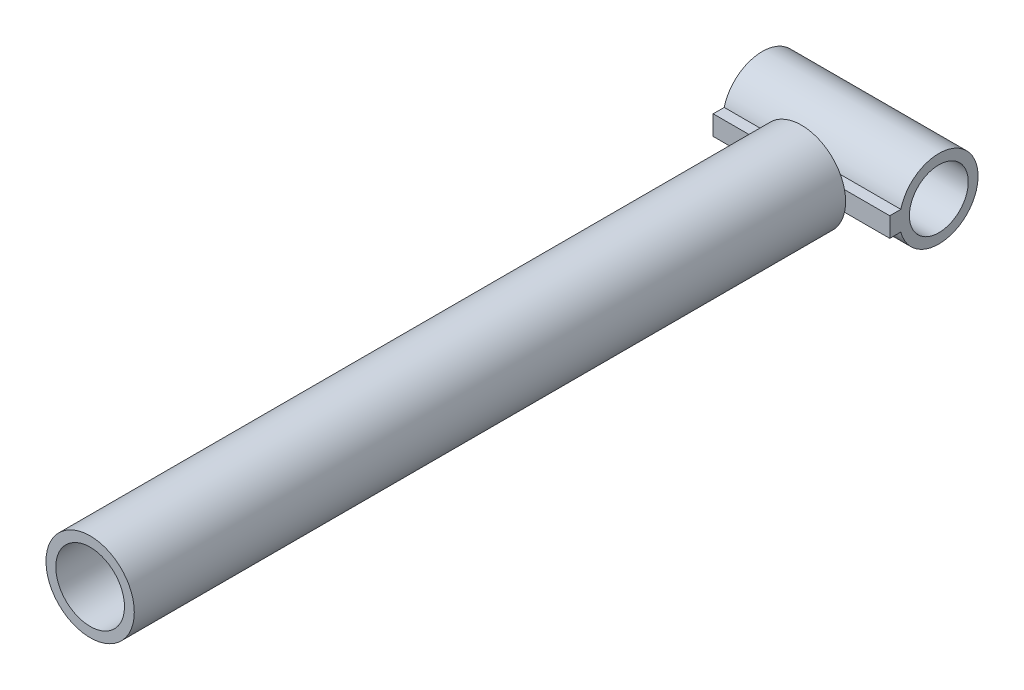
ISO-10303-21;
HEADER;
FILE_DESCRIPTION(('STEP AP214'),'2;1');
FILE_NAME('part.step','',(''),(''),'','','');
FILE_SCHEMA(('AUTOMOTIVE_DESIGN { 1 0 10303 214 1 1 1 1 }'));
ENDSEC;
DATA;
#1=APPLICATION_CONTEXT('core data for automotive mechanical design processes');
#2=APPLICATION_PROTOCOL_DEFINITION('international standard','automotive_design',2000,#1);
#3=PRODUCT_CONTEXT('',#1,'mechanical');
#4=PRODUCT('Part','Part','',(#3));
#5=PRODUCT_RELATED_PRODUCT_CATEGORY('part','',(#4));
#6=PRODUCT_DEFINITION_FORMATION('','',#4);
#7=PRODUCT_DEFINITION_CONTEXT('part definition',#1,'design');
#8=PRODUCT_DEFINITION('design','',#6,#7);
#9=PRODUCT_DEFINITION_SHAPE('','',#8);
#10=(LENGTH_UNIT() NAMED_UNIT(*) SI_UNIT(.MILLI.,.METRE.));
#11=(NAMED_UNIT(*) PLANE_ANGLE_UNIT() SI_UNIT($,.RADIAN.));
#12=(NAMED_UNIT(*) SI_UNIT($,.STERADIAN.) SOLID_ANGLE_UNIT());
#13=UNCERTAINTY_MEASURE_WITH_UNIT(LENGTH_MEASURE(1.E-05),#10,'distance_accuracy_value','');
#14=(GEOMETRIC_REPRESENTATION_CONTEXT(3) GLOBAL_UNCERTAINTY_ASSIGNED_CONTEXT((#13)) GLOBAL_UNIT_ASSIGNED_CONTEXT((#10,
#11,#12)) REPRESENTATION_CONTEXT('',''));
#15=CARTESIAN_POINT('',(0.,0.,0.));
#16=DIRECTION('',(0.,0.,1.));
#17=DIRECTION('',(1.,0.,0.));
#18=AXIS2_PLACEMENT_3D('',#15,#16,#17);
#19=CARTESIAN_POINT('',(0.,0.,0.));
#20=DIRECTION('',(0.,0.,1.));
#21=DIRECTION('',(1.,0.,0.));
#22=AXIS2_PLACEMENT_3D('',#19,#20,#21);
#23=PLANE('',#22);
#24=DIRECTION('',(-1.,0.,0.));
#25=VECTOR('',#24,1.);
#26=CARTESIAN_POINT('',(90.,-10.,0.));
#27=LINE('',#26,#25);
#28=CARTESIAN_POINT('',(43.8748219369606,-10.,0.));
#29=VERTEX_POINT('',#28);
#30=CARTESIAN_POINT('',(-43.8748219369605,-10.,0.));
#31=VERTEX_POINT('',#30);
#32=EDGE_CURVE('E11',#29,#31,#27,.T.);
#33=ORIENTED_EDGE('',*,*,#32,.F.);
#34=CARTESIAN_POINT('',(0.,0.,0.));
#35=DIRECTION('',(0.,0.,1.));
#36=DIRECTION('',(1.,0.,0.));
#37=AXIS2_PLACEMENT_3D('',#34,#35,#36);
#38=CIRCLE('',#37,45.);
#39=EDGE_CURVE('E132',#31,#29,#38,.T.);
#40=ORIENTED_EDGE('',*,*,#39,.F.);
#41=EDGE_LOOP('',(#33,#40));
#42=FACE_BOUND('',#41,.T.);
#43=ADVANCED_FACE('F34',(#42),#23,.F.);
#44=CARTESIAN_POINT('',(0.,0.,725.));
#45=DIRECTION('',(0.,0.,-1.));
#46=DIRECTION('',(-1.,0.,0.));
#47=AXIS2_PLACEMENT_3D('',#44,#45,#46);
#48=CYLINDRICAL_SURFACE('',#47,45.);
#49=CARTESIAN_POINT('',(0.,0.,725.));
#50=DIRECTION('',(0.,0.,1.));
#51=DIRECTION('',(1.,0.,0.));
#52=AXIS2_PLACEMENT_3D('',#49,#50,#51);
#53=CIRCLE('',#52,45.);
#54=CARTESIAN_POINT('',(45.,0.,725.));
#55=VERTEX_POINT('',#54);
#56=EDGE_CURVE('E121',#55,#55,#53,.T.);
#57=ORIENTED_EDGE('',*,*,#56,.F.);
#58=EDGE_LOOP('',(#57));
#59=FACE_BOUND('',#58,.T.);
#60=CARTESIAN_POINT('',(43.8748219369606,9.99999999999999,0.));
#61=VERTEX_POINT('',#60);
#62=CARTESIAN_POINT('',(-43.8748219369606,9.99999999999998,0.));
#63=VERTEX_POINT('',#62);
#64=EDGE_CURVE('E38',#61,#63,#38,.T.);
#65=ORIENTED_EDGE('',*,*,#64,.T.);
#66=EDGE_CURVE('E128',#63,#31,#38,.T.);
#67=ORIENTED_EDGE('',*,*,#66,.T.);
#68=ORIENTED_EDGE('',*,*,#39,.T.);
#69=EDGE_CURVE('E112',#29,#61,#38,.T.);
#70=ORIENTED_EDGE('',*,*,#69,.T.);
#71=EDGE_LOOP('',(#65,#67,#68,#70));
#72=FACE_BOUND('',#71,.T.);
#73=ADVANCED_FACE('F36',(#59,#72),#48,.T.);
#74=CARTESIAN_POINT('',(0.,0.,725.));
#75=DIRECTION('',(0.,0.,1.));
#76=DIRECTION('',(1.,0.,0.));
#77=AXIS2_PLACEMENT_3D('',#74,#75,#76);
#78=PLANE('',#77);
#79=CARTESIAN_POINT('',(0.,0.,725.));
#80=DIRECTION('',(0.,0.,1.));
#81=DIRECTION('',(1.,0.,0.));
#82=AXIS2_PLACEMENT_3D('',#79,#80,#81);
#83=CIRCLE('',#82,35.);
#84=CARTESIAN_POINT('',(35.,0.,725.));
#85=VERTEX_POINT('',#84);
#86=EDGE_CURVE('E113',#85,#85,#83,.T.);
#87=ORIENTED_EDGE('',*,*,#86,.F.);
#88=EDGE_LOOP('',(#87));
#89=FACE_BOUND('',#88,.T.);
#90=ORIENTED_EDGE('',*,*,#56,.T.);
#91=EDGE_LOOP('',(#90));
#92=FACE_BOUND('',#91,.T.);
#93=ADVANCED_FACE('F183',(#89,#92),#78,.T.);
#94=ORIENTED_EDGE('',*,*,#64,.F.);
#95=DIRECTION('',(-1.,0.,0.));
#96=VECTOR('',#95,1.);
#97=CARTESIAN_POINT('',(90.,9.99999999999999,0.));
#98=LINE('',#97,#96);
#99=EDGE_CURVE('E43',#61,#63,#98,.T.);
#100=ORIENTED_EDGE('',*,*,#99,.T.);
#101=EDGE_LOOP('',(#94,#100));
#102=FACE_BOUND('',#101,.T.);
#103=ADVANCED_FACE('F179',(#102),#23,.F.);
#104=CARTESIAN_POINT('',(0.,0.,125.));
#105=DIRECTION('',(0.,0.,1.));
#106=DIRECTION('',(1.,0.,0.));
#107=AXIS2_PLACEMENT_3D('',#104,#105,#106);
#108=CYLINDRICAL_SURFACE('',#107,35.);
#109=CARTESIAN_POINT('',(0.,0.,125.));
#110=DIRECTION('',(0.,0.,1.));
#111=DIRECTION('',(1.,0.,0.));
#112=AXIS2_PLACEMENT_3D('',#109,#110,#111);
#113=CIRCLE('',#112,35.);
#114=CARTESIAN_POINT('',(35.,0.,125.));
#115=VERTEX_POINT('',#114);
#116=EDGE_CURVE('E115',#115,#115,#113,.T.);
#117=ORIENTED_EDGE('',*,*,#116,.F.);
#118=EDGE_LOOP('',(#117));
#119=FACE_BOUND('',#118,.T.);
#120=ORIENTED_EDGE('',*,*,#86,.T.);
#121=EDGE_LOOP('',(#120));
#122=FACE_BOUND('',#121,.T.);
#123=ADVANCED_FACE('F187',(#119,#122),#108,.F.);
#124=CARTESIAN_POINT('',(0.,0.,125.));
#125=DIRECTION('',(0.,0.,1.));
#126=DIRECTION('',(1.,0.,0.));
#127=AXIS2_PLACEMENT_3D('',#124,#125,#126);
#128=PLANE('',#127);
#129=ORIENTED_EDGE('',*,*,#116,.T.);
#130=EDGE_LOOP('',(#129));
#131=FACE_BOUND('',#130,.T.);
#132=ADVANCED_FACE('F193',(#131),#128,.T.);
#133=CARTESIAN_POINT('',(90.,9.99999999999999,0.));
#134=DIRECTION('',(0.,0.,-1.));
#135=DIRECTION('',(-1.,0.,0.));
#136=AXIS2_PLACEMENT_3D('',#133,#134,#135);
#137=PLANE('',#136);
#138=ORIENTED_EDGE('',*,*,#66,.F.);
#139=CARTESIAN_POINT('',(-90.,9.99999999999999,0.));
#140=VERTEX_POINT('',#139);
#141=EDGE_CURVE('E53',#63,#140,#98,.T.);
#142=ORIENTED_EDGE('',*,*,#141,.T.);
#143=DIRECTION('',(0.,-1.,0.));
#144=VECTOR('',#143,1.);
#145=CARTESIAN_POINT('',(-90.,9.99999999999999,0.));
#146=LINE('',#145,#144);
#147=CARTESIAN_POINT('',(-90.,-10.,0.));
#148=VERTEX_POINT('',#147);
#149=EDGE_CURVE('E146',#140,#148,#146,.T.);
#150=ORIENTED_EDGE('',*,*,#149,.T.);
#151=EDGE_CURVE('E46',#31,#148,#27,.T.);
#152=ORIENTED_EDGE('',*,*,#151,.F.);
#153=EDGE_LOOP('',(#138,#142,#150,#152));
#154=FACE_BOUND('',#153,.T.);
#155=ADVANCED_FACE('F149',(#154),#137,.F.);
#156=CARTESIAN_POINT('',(90.,0.,-50.));
#157=DIRECTION('',(1.,0.,0.));
#158=DIRECTION('',(0.,0.,-1.));
#159=AXIS2_PLACEMENT_3D('',#156,#157,#158);
#160=PLANE('',#159);
#161=DIRECTION('',(0.,-1.,0.));
#162=VECTOR('',#161,1.);
#163=CARTESIAN_POINT('',(90.,9.99999999999999,0.));
#164=LINE('',#163,#162);
#165=CARTESIAN_POINT('',(90.,9.99999999999999,0.));
#166=VERTEX_POINT('',#165);
#167=CARTESIAN_POINT('',(90.,-10.,0.));
#168=VERTEX_POINT('',#167);
#169=EDGE_CURVE('E100',#166,#168,#164,.T.);
#170=ORIENTED_EDGE('',*,*,#169,.T.);
#171=DIRECTION('',(0.,0.,-1.));
#172=VECTOR('',#171,1.);
#173=CARTESIAN_POINT('',(90.,-10.,0.));
#174=LINE('',#173,#172);
#175=CARTESIAN_POINT('',(90.,-10.,-11.2701665379259));
#176=VERTEX_POINT('',#175);
#177=EDGE_CURVE('E90',#168,#176,#174,.T.);
#178=ORIENTED_EDGE('',*,*,#177,.T.);
#179=CARTESIAN_POINT('',(90.,0.,-50.));
#180=DIRECTION('',(1.,0.,0.));
#181=DIRECTION('',(0.,0.,-1.));
#182=AXIS2_PLACEMENT_3D('',#179,#180,#181);
#183=CIRCLE('',#182,40.);
#184=CARTESIAN_POINT('',(90.,9.99999999999999,-11.2701665379258));
#185=VERTEX_POINT('',#184);
#186=EDGE_CURVE('E99',#176,#185,#183,.T.);
#187=ORIENTED_EDGE('',*,*,#186,.T.);
#188=DIRECTION('',(0.,0.,1.));
#189=VECTOR('',#188,1.);
#190=CARTESIAN_POINT('',(90.,9.99999999999999,0.));
#191=LINE('',#190,#189);
#192=EDGE_CURVE('E106',#185,#166,#191,.T.);
#193=ORIENTED_EDGE('',*,*,#192,.T.);
#194=EDGE_LOOP('',(#170,#178,#187,#193));
#195=FACE_BOUND('',#194,.T.);
#196=CARTESIAN_POINT('',(90.,0.,-50.));
#197=DIRECTION('',(1.,0.,0.));
#198=DIRECTION('',(0.,0.,-1.));
#199=AXIS2_PLACEMENT_3D('',#196,#197,#198);
#200=CIRCLE('',#199,30.);
#201=CARTESIAN_POINT('',(90.,0.,-20.));
#202=VERTEX_POINT('',#201);
#203=EDGE_CURVE('E150',#202,#202,#200,.T.);
#204=ORIENTED_EDGE('',*,*,#203,.F.);
#205=EDGE_LOOP('',(#204));
#206=FACE_BOUND('',#205,.T.);
#207=ADVANCED_FACE('F103',(#195,#206),#160,.T.);
#208=CARTESIAN_POINT('',(-90.,0.,-50.));
#209=DIRECTION('',(1.,0.,0.));
#210=DIRECTION('',(0.,0.,-1.));
#211=AXIS2_PLACEMENT_3D('',#208,#209,#210);
#212=PLANE('',#211);
#213=ORIENTED_EDGE('',*,*,#149,.F.);
#214=DIRECTION('',(0.,0.,1.));
#215=VECTOR('',#214,1.);
#216=CARTESIAN_POINT('',(-90.,9.99999999999999,0.));
#217=LINE('',#216,#215);
#218=CARTESIAN_POINT('',(-90.,9.99999999999999,-11.2701665379258));
#219=VERTEX_POINT('',#218);
#220=EDGE_CURVE('E108',#219,#140,#217,.T.);
#221=ORIENTED_EDGE('',*,*,#220,.F.);
#222=CARTESIAN_POINT('',(-90.,0.,-50.));
#223=DIRECTION('',(1.,0.,0.));
#224=DIRECTION('',(0.,0.,-1.));
#225=AXIS2_PLACEMENT_3D('',#222,#223,#224);
#226=CIRCLE('',#225,40.);
#227=CARTESIAN_POINT('',(-90.,-10.,-11.2701665379259));
#228=VERTEX_POINT('',#227);
#229=EDGE_CURVE('E147',#228,#219,#226,.T.);
#230=ORIENTED_EDGE('',*,*,#229,.F.);
#231=DIRECTION('',(0.,0.,-1.));
#232=VECTOR('',#231,1.);
#233=CARTESIAN_POINT('',(-90.,-10.,0.));
#234=LINE('',#233,#232);
#235=EDGE_CURVE('E137',#148,#228,#234,.T.);
#236=ORIENTED_EDGE('',*,*,#235,.F.);
#237=EDGE_LOOP('',(#213,#221,#230,#236));
#238=FACE_BOUND('',#237,.T.);
#239=CARTESIAN_POINT('',(-90.,0.,-50.));
#240=DIRECTION('',(1.,0.,0.));
#241=DIRECTION('',(0.,0.,-1.));
#242=AXIS2_PLACEMENT_3D('',#239,#240,#241);
#243=CIRCLE('',#242,30.);
#244=CARTESIAN_POINT('',(-90.,0.,-20.));
#245=VERTEX_POINT('',#244);
#246=EDGE_CURVE('E153',#245,#245,#243,.T.);
#247=ORIENTED_EDGE('',*,*,#246,.T.);
#248=EDGE_LOOP('',(#247));
#249=FACE_BOUND('',#248,.T.);
#250=ADVANCED_FACE('F143',(#238,#249),#212,.F.);
#251=ORIENTED_EDGE('',*,*,#69,.F.);
#252=EDGE_CURVE('E45',#168,#29,#27,.T.);
#253=ORIENTED_EDGE('',*,*,#252,.F.);
#254=ORIENTED_EDGE('',*,*,#169,.F.);
#255=EDGE_CURVE('E126',#166,#61,#98,.T.);
#256=ORIENTED_EDGE('',*,*,#255,.T.);
#257=EDGE_LOOP('',(#251,#253,#254,#256));
#258=FACE_BOUND('',#257,.T.);
#259=ADVANCED_FACE('F110',(#258),#137,.F.);
#260=CARTESIAN_POINT('',(90.,-10.,0.));
#261=DIRECTION('',(0.,1.,0.));
#262=DIRECTION('',(0.,0.,1.));
#263=AXIS2_PLACEMENT_3D('',#260,#261,#262);
#264=PLANE('',#263);
#265=ORIENTED_EDGE('',*,*,#235,.T.);
#266=DIRECTION('',(-1.,0.,0.));
#267=VECTOR('',#266,1.);
#268=CARTESIAN_POINT('',(90.,-10.,-11.2701665379259));
#269=LINE('',#268,#267);
#270=EDGE_CURVE('E96',#176,#228,#269,.T.);
#271=ORIENTED_EDGE('',*,*,#270,.F.);
#272=ORIENTED_EDGE('',*,*,#177,.F.);
#273=ORIENTED_EDGE('',*,*,#252,.T.);
#274=ORIENTED_EDGE('',*,*,#32,.T.);
#275=ORIENTED_EDGE('',*,*,#151,.T.);
#276=EDGE_LOOP('',(#265,#271,#272,#273,#274,#275));
#277=FACE_BOUND('',#276,.T.);
#278=ADVANCED_FACE('F92',(#277),#264,.F.);
#279=CARTESIAN_POINT('',(90.,0.,-50.));
#280=DIRECTION('',(-1.,0.,0.));
#281=DIRECTION('',(0.,0.,1.));
#282=AXIS2_PLACEMENT_3D('',#279,#280,#281);
#283=CYLINDRICAL_SURFACE('',#282,40.);
#284=ORIENTED_EDGE('',*,*,#229,.T.);
#285=DIRECTION('',(-1.,0.,0.));
#286=VECTOR('',#285,1.);
#287=CARTESIAN_POINT('',(90.,9.99999999999999,-11.2701665379258));
#288=LINE('',#287,#286);
#289=EDGE_CURVE('E159',#185,#219,#288,.T.);
#290=ORIENTED_EDGE('',*,*,#289,.F.);
#291=ORIENTED_EDGE('',*,*,#186,.F.);
#292=ORIENTED_EDGE('',*,*,#270,.T.);
#293=EDGE_LOOP('',(#284,#290,#291,#292));
#294=FACE_BOUND('',#293,.T.);
#295=ADVANCED_FACE('F163',(#294),#283,.T.);
#296=CARTESIAN_POINT('',(90.,9.99999999999999,0.));
#297=DIRECTION('',(0.,-1.,0.));
#298=DIRECTION('',(0.,0.,-1.));
#299=AXIS2_PLACEMENT_3D('',#296,#297,#298);
#300=PLANE('',#299);
#301=ORIENTED_EDGE('',*,*,#220,.T.);
#302=ORIENTED_EDGE('',*,*,#141,.F.);
#303=ORIENTED_EDGE('',*,*,#99,.F.);
#304=ORIENTED_EDGE('',*,*,#255,.F.);
#305=ORIENTED_EDGE('',*,*,#192,.F.);
#306=ORIENTED_EDGE('',*,*,#289,.T.);
#307=EDGE_LOOP('',(#301,#302,#303,#304,#305,#306));
#308=FACE_BOUND('',#307,.T.);
#309=ADVANCED_FACE('F170',(#308),#300,.F.);
#310=CARTESIAN_POINT('',(90.,0.,-50.));
#311=DIRECTION('',(-1.,0.,0.));
#312=DIRECTION('',(0.,0.,1.));
#313=AXIS2_PLACEMENT_3D('',#310,#311,#312);
#314=CYLINDRICAL_SURFACE('',#313,30.);
#315=CARTESIAN_POINT('',(90.,0.,-20.));
#316=CARTESIAN_POINT('',(88.125,0.,-20.));
#317=CARTESIAN_POINT('',(86.25,0.,-20.));
#318=CARTESIAN_POINT('',(82.5,0.,-20.));
#319=CARTESIAN_POINT('',(80.625,0.,-20.));
#320=CARTESIAN_POINT('',(76.875,0.,-20.));
#321=CARTESIAN_POINT('',(75.,0.,-20.));
#322=CARTESIAN_POINT('',(71.25,0.,-20.));
#323=CARTESIAN_POINT('',(69.375,0.,-20.));
#324=CARTESIAN_POINT('',(65.625,0.,-20.));
#325=CARTESIAN_POINT('',(63.75,0.,-20.));
#326=CARTESIAN_POINT('',(60.,0.,-20.));
#327=CARTESIAN_POINT('',(58.125,0.,-20.));
#328=CARTESIAN_POINT('',(54.375,0.,-20.));
#329=CARTESIAN_POINT('',(52.5,0.,-20.));
#330=CARTESIAN_POINT('',(48.75,0.,-20.));
#331=CARTESIAN_POINT('',(46.875,0.,-20.));
#332=CARTESIAN_POINT('',(43.125,0.,-20.));
#333=CARTESIAN_POINT('',(41.25,0.,-20.));
#334=CARTESIAN_POINT('',(37.5,0.,-20.));
#335=CARTESIAN_POINT('',(35.625,0.,-20.));
#336=CARTESIAN_POINT('',(31.875,0.,-20.));
#337=CARTESIAN_POINT('',(30.,0.,-20.));
#338=CARTESIAN_POINT('',(26.25,0.,-20.));
#339=CARTESIAN_POINT('',(24.375,0.,-20.));
#340=CARTESIAN_POINT('',(20.625,0.,-20.));
#341=CARTESIAN_POINT('',(18.75,0.,-20.));
#342=CARTESIAN_POINT('',(15.,0.,-20.));
#343=CARTESIAN_POINT('',(13.125,0.,-20.));
#344=CARTESIAN_POINT('',(9.37499999999998,0.,-20.));
#345=CARTESIAN_POINT('',(7.49999999999998,0.,-20.));
#346=CARTESIAN_POINT('',(3.74999999999998,0.,-20.));
#347=CARTESIAN_POINT('',(1.87499999999997,0.,-20.));
#348=CARTESIAN_POINT('',(-1.87500000000003,0.,-20.));
#349=CARTESIAN_POINT('',(-3.75000000000003,0.,-20.));
#350=CARTESIAN_POINT('',(-7.50000000000003,0.,-20.));
#351=CARTESIAN_POINT('',(-9.37500000000004,0.,-20.));
#352=CARTESIAN_POINT('',(-13.125,0.,-20.));
#353=CARTESIAN_POINT('',(-15.,0.,-20.));
#354=CARTESIAN_POINT('',(-18.75,0.,-20.));
#355=CARTESIAN_POINT('',(-20.625,0.,-20.));
#356=CARTESIAN_POINT('',(-24.375,0.,-20.));
#357=CARTESIAN_POINT('',(-26.25,0.,-20.));
#358=CARTESIAN_POINT('',(-30.,0.,-20.));
#359=CARTESIAN_POINT('',(-31.875,0.,-20.));
#360=CARTESIAN_POINT('',(-35.625,0.,-20.));
#361=CARTESIAN_POINT('',(-37.5,0.,-20.));
#362=CARTESIAN_POINT('',(-41.25,0.,-20.));
#363=CARTESIAN_POINT('',(-43.125,0.,-20.));
#364=CARTESIAN_POINT('',(-46.875,0.,-20.));
#365=CARTESIAN_POINT('',(-48.75,0.,-20.));
#366=CARTESIAN_POINT('',(-52.5,0.,-20.));
#367=CARTESIAN_POINT('',(-54.375,0.,-20.));
#368=CARTESIAN_POINT('',(-58.125,0.,-20.));
#369=CARTESIAN_POINT('',(-60.,0.,-20.));
#370=CARTESIAN_POINT('',(-63.75,0.,-20.));
#371=CARTESIAN_POINT('',(-65.625,0.,-20.));
#372=CARTESIAN_POINT('',(-69.375,0.,-20.));
#373=CARTESIAN_POINT('',(-71.25,0.,-20.));
#374=CARTESIAN_POINT('',(-75.,0.,-20.));
#375=CARTESIAN_POINT('',(-76.875,0.,-20.));
#376=CARTESIAN_POINT('',(-80.625,0.,-20.));
#377=CARTESIAN_POINT('',(-82.5,0.,-20.));
#378=CARTESIAN_POINT('',(-86.25,0.,-20.));
#379=CARTESIAN_POINT('',(-88.125,0.,-20.));
#380=CARTESIAN_POINT('',(-90.,0.,-20.));
#381=B_SPLINE_CURVE_WITH_KNOTS('',3,(#315,#316,#317,#318,#319,#320,#321,#322,#323,#324,#325,
#326,#327,#328,#329,#330,#331,#332,#333,#334,#335,#336,#337,#338,#339,#340,#341,#342,#343,#344,
#345,#346,#347,#348,#349,#350,#351,#352,#353,#354,#355,#356,#357,#358,#359,#360,#361,#362,#363,
#364,#365,#366,#367,#368,#369,#370,#371,#372,#373,#374,#375,#376,#377,#378,#379,#380),
.UNSPECIFIED.,.F.,.F.,(4,2,2,2,2,2,2,2,2,2,2,2,2,2,2,2,2,2,2,2,2,2,2,2,2,2,2,2,2,2,2,2,4),(0.,
5.62499999999999,11.25,16.875,22.5,28.125,33.75,39.375,45.,50.625,56.25,61.875,67.5,73.125,
78.75,84.375,90.,95.625,101.25,106.875,112.5,118.125,123.75,129.375,135.,140.625,146.25,151.875,
157.5,163.125,168.75,174.375,180.),.UNSPECIFIED.);
#382=EDGE_CURVE('BSEAM168',#202,#245,#381,.T.);
#383=ORIENTED_EDGE('',*,*,#203,.T.);
#384=ORIENTED_EDGE('',*,*,#246,.F.);
#385=ORIENTED_EDGE('',*,*,#382,.T.);
#386=ORIENTED_EDGE('',*,*,#382,.F.);
#387=EDGE_LOOP('',(#383,#385,#384,#386));
#388=FACE_BOUND('',#387,.T.);
#389=ADVANCED_FACE('F168',(#388),#314,.F.);
#390=CLOSED_SHELL('',(#43,#73,#93,#103,#123,#132,#155,#207,#250,#259,#278,#295,#309,#389));
#391=MANIFOLD_SOLID_BREP('B2',#390);
#392=ADVANCED_BREP_SHAPE_REPRESENTATION('',(#18,#391),#14);
#393=SHAPE_DEFINITION_REPRESENTATION(#9,#392);
ENDSEC;
END-ISO-10303-21;
